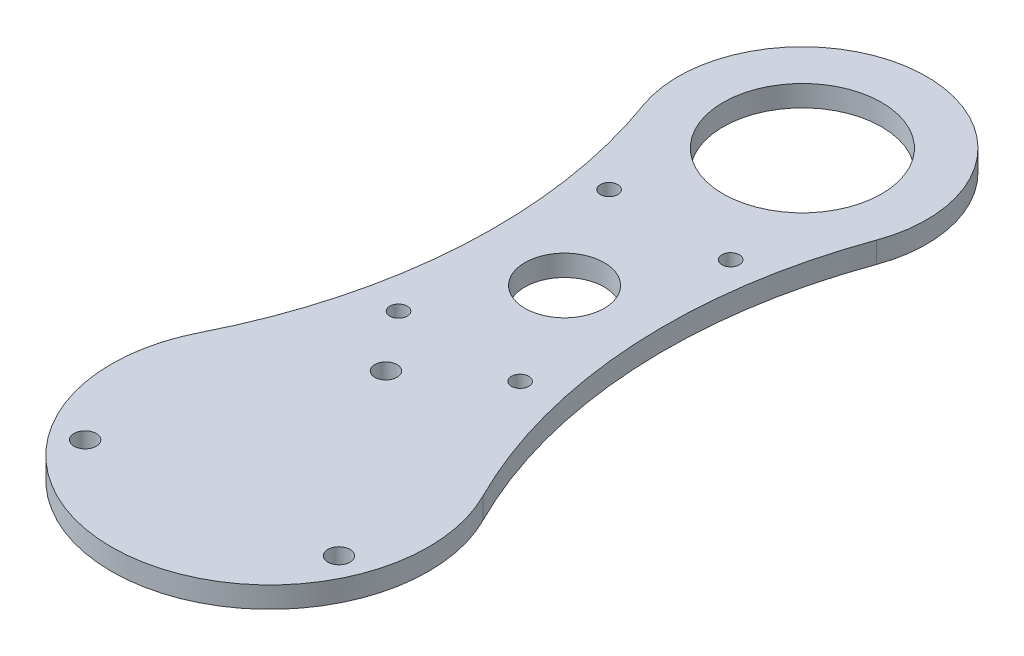
ISO-10303-21;
HEADER;
FILE_DESCRIPTION(('STEP AP214'),'2;1');
FILE_NAME('part.step','',(''),(''),'','','');
FILE_SCHEMA(('AUTOMOTIVE_DESIGN { 1 0 10303 214 1 1 1 1 }'));
ENDSEC;
DATA;
#1=APPLICATION_CONTEXT('core data for automotive mechanical design processes');
#2=APPLICATION_PROTOCOL_DEFINITION('international standard','automotive_design',2000,#1);
#3=PRODUCT_CONTEXT('',#1,'mechanical');
#4=PRODUCT('Part','Part','',(#3));
#5=PRODUCT_RELATED_PRODUCT_CATEGORY('part','',(#4));
#6=PRODUCT_DEFINITION_FORMATION('','',#4);
#7=PRODUCT_DEFINITION_CONTEXT('part definition',#1,'design');
#8=PRODUCT_DEFINITION('design','',#6,#7);
#9=PRODUCT_DEFINITION_SHAPE('','',#8);
#10=(LENGTH_UNIT() NAMED_UNIT(*) SI_UNIT(.MILLI.,.METRE.));
#11=(NAMED_UNIT(*) PLANE_ANGLE_UNIT() SI_UNIT($,.RADIAN.));
#12=(NAMED_UNIT(*) SI_UNIT($,.STERADIAN.) SOLID_ANGLE_UNIT());
#13=UNCERTAINTY_MEASURE_WITH_UNIT(LENGTH_MEASURE(1.E-05),#10,'distance_accuracy_value','');
#14=(GEOMETRIC_REPRESENTATION_CONTEXT(3) GLOBAL_UNCERTAINTY_ASSIGNED_CONTEXT((#13)) GLOBAL_UNIT_ASSIGNED_CONTEXT((#10,
#11,#12)) REPRESENTATION_CONTEXT('',''));
#15=CARTESIAN_POINT('',(0.,0.,0.));
#16=DIRECTION('',(0.,0.,1.));
#17=DIRECTION('',(1.,0.,0.));
#18=AXIS2_PLACEMENT_3D('',#15,#16,#17);
#19=CARTESIAN_POINT('',(-116.069395777869,4.,-58.5482310899345));
#20=DIRECTION('',(0.,-1.,0.));
#21=DIRECTION('',(0.,0.,-1.));
#22=AXIS2_PLACEMENT_3D('',#19,#20,#21);
#23=CYLINDRICAL_SURFACE('',#22,100.);
#24=CARTESIAN_POINT('',(-116.069395777869,0.,-58.5482310899345));
#25=DIRECTION('',(0.,1.,0.));
#26=DIRECTION('',(0.,0.,1.));
#27=AXIS2_PLACEMENT_3D('',#24,#25,#26);
#28=CIRCLE('',#27,100.);
#29=CARTESIAN_POINT('',(-26.7852451795083,0.,-13.5111302515233));
#30=VERTEX_POINT('',#29);
#31=CARTESIAN_POINT('',(-22.0860793585419,0.,-92.7116067256151));
#32=VERTEX_POINT('',#31);
#33=EDGE_CURVE('E101',#30,#32,#28,.T.);
#34=ORIENTED_EDGE('',*,*,#33,.F.);
#35=DIRECTION('',(0.,-1.,0.));
#36=VECTOR('',#35,1.);
#37=CARTESIAN_POINT('',(-26.7852451795083,4.,-13.5111302515233));
#38=LINE('',#37,#36);
#39=CARTESIAN_POINT('',(-26.7852451795083,4.,-13.5111302515233));
#40=VERTEX_POINT('',#39);
#41=EDGE_CURVE('E61',#40,#30,#38,.T.);
#42=ORIENTED_EDGE('',*,*,#41,.F.);
#43=CARTESIAN_POINT('',(-116.069395777869,4.,-58.5482310899345));
#44=DIRECTION('',(0.,1.,0.));
#45=DIRECTION('',(0.,0.,1.));
#46=AXIS2_PLACEMENT_3D('',#43,#44,#45);
#47=CIRCLE('',#46,100.);
#48=CARTESIAN_POINT('',(-22.0860793585419,4.,-92.7116067256151));
#49=VERTEX_POINT('',#48);
#50=EDGE_CURVE('E99',#40,#49,#47,.T.);
#51=ORIENTED_EDGE('',*,*,#50,.T.);
#52=DIRECTION('',(0.,-1.,0.));
#53=VECTOR('',#52,1.);
#54=CARTESIAN_POINT('',(-22.0860793585419,4.,-92.7116067256151));
#55=LINE('',#54,#53);
#56=EDGE_CURVE('E12',#49,#32,#55,.T.);
#57=ORIENTED_EDGE('',*,*,#56,.T.);
#58=EDGE_LOOP('',(#34,#42,#51,#57));
#59=FACE_BOUND('',#58,.T.);
#60=ADVANCED_FACE('F51',(#59),#23,.F.);
#61=CARTESIAN_POINT('',(0.,4.,0.));
#62=DIRECTION('',(0.,-1.,0.));
#63=DIRECTION('',(0.,0.,-1.));
#64=AXIS2_PLACEMENT_3D('',#61,#62,#63);
#65=CYLINDRICAL_SURFACE('',#64,30.);
#66=CARTESIAN_POINT('',(0.,0.,0.));
#67=DIRECTION('',(0.,1.,0.));
#68=DIRECTION('',(0.,0.,1.));
#69=AXIS2_PLACEMENT_3D('',#66,#67,#68);
#70=CIRCLE('',#69,30.);
#71=CARTESIAN_POINT('',(26.7852451795083,0.,-13.5111302515233));
#72=VERTEX_POINT('',#71);
#73=EDGE_CURVE('E116',#30,#72,#70,.T.);
#74=ORIENTED_EDGE('',*,*,#73,.T.);
#75=DIRECTION('',(0.,-1.,0.));
#76=VECTOR('',#75,1.);
#77=CARTESIAN_POINT('',(26.7852451795083,4.,-13.5111302515233));
#78=LINE('',#77,#76);
#79=CARTESIAN_POINT('',(26.7852451795083,4.,-13.5111302515233));
#80=VERTEX_POINT('',#79);
#81=EDGE_CURVE('E84',#80,#72,#78,.T.);
#82=ORIENTED_EDGE('',*,*,#81,.F.);
#83=CARTESIAN_POINT('',(0.,4.,0.));
#84=DIRECTION('',(0.,1.,0.));
#85=DIRECTION('',(0.,0.,1.));
#86=AXIS2_PLACEMENT_3D('',#83,#84,#85);
#87=CIRCLE('',#86,30.);
#88=EDGE_CURVE('E105',#40,#80,#87,.T.);
#89=ORIENTED_EDGE('',*,*,#88,.F.);
#90=ORIENTED_EDGE('',*,*,#41,.T.);
#91=EDGE_LOOP('',(#74,#82,#89,#90));
#92=FACE_BOUND('',#91,.T.);
#93=ADVANCED_FACE('F106',(#92),#65,.T.);
#94=CARTESIAN_POINT('',(116.069395777869,4.,-58.5482310899345));
#95=DIRECTION('',(0.,-1.,0.));
#96=DIRECTION('',(0.,0.,-1.));
#97=AXIS2_PLACEMENT_3D('',#94,#95,#96);
#98=CYLINDRICAL_SURFACE('',#97,100.);
#99=CARTESIAN_POINT('',(116.069395777869,0.,-58.5482310899345));
#100=DIRECTION('',(0.,1.,0.));
#101=DIRECTION('',(0.,0.,1.));
#102=AXIS2_PLACEMENT_3D('',#99,#100,#101);
#103=CIRCLE('',#102,100.);
#104=CARTESIAN_POINT('',(22.0860793585419,0.,-92.7116067256151));
#105=VERTEX_POINT('',#104);
#106=EDGE_CURVE('E113',#105,#72,#103,.T.);
#107=ORIENTED_EDGE('',*,*,#106,.F.);
#108=DIRECTION('',(0.,-1.,0.));
#109=VECTOR('',#108,1.);
#110=CARTESIAN_POINT('',(22.0860793585419,4.,-92.7116067256151));
#111=LINE('',#110,#109);
#112=CARTESIAN_POINT('',(22.0860793585419,4.,-92.7116067256151));
#113=VERTEX_POINT('',#112);
#114=EDGE_CURVE('E70',#113,#105,#111,.T.);
#115=ORIENTED_EDGE('',*,*,#114,.F.);
#116=CARTESIAN_POINT('',(116.069395777869,4.,-58.5482310899345));
#117=DIRECTION('',(0.,1.,0.));
#118=DIRECTION('',(0.,0.,1.));
#119=AXIS2_PLACEMENT_3D('',#116,#117,#118);
#120=CIRCLE('',#119,100.);
#121=EDGE_CURVE('E109',#113,#80,#120,.T.);
#122=ORIENTED_EDGE('',*,*,#121,.T.);
#123=ORIENTED_EDGE('',*,*,#81,.T.);
#124=EDGE_LOOP('',(#107,#115,#122,#123));
#125=FACE_BOUND('',#124,.T.);
#126=ADVANCED_FACE('F187',(#125),#98,.F.);
#127=CARTESIAN_POINT('',(0.,0.,0.));
#128=DIRECTION('',(0.,1.,0.));
#129=DIRECTION('',(0.,0.,1.));
#130=AXIS2_PLACEMENT_3D('',#127,#128,#129);
#131=PLANE('',#130);
#132=CARTESIAN_POINT('',(0.,0.,-100.74));
#133=DIRECTION('',(0.,-1.,0.));
#134=DIRECTION('',(0.,0.,-1.));
#135=AXIS2_PLACEMENT_3D('',#132,#133,#134);
#136=CIRCLE('',#135,15.);
#137=CARTESIAN_POINT('',(0.,0.,-115.74));
#138=VERTEX_POINT('',#137);
#139=EDGE_CURVE('E345',#138,#138,#136,.T.);
#140=ORIENTED_EDGE('',*,*,#139,.F.);
#141=EDGE_LOOP('',(#140));
#142=FACE_BOUND('',#141,.T.);
#143=CARTESIAN_POINT('',(11.5000000000002,0.,-75.6585842870419));
#144=DIRECTION('',(0.,-1.,0.));
#145=DIRECTION('',(-0.866025403784443,0.,0.499999999999992));
#146=AXIS2_PLACEMENT_3D('',#143,#144,#145);
#147=CIRCLE('',#146,1.65);
#148=CARTESIAN_POINT('',(10.0710580837559,0.,-74.833584287042));
#149=VERTEX_POINT('',#148);
#150=EDGE_CURVE('E341',#149,#149,#147,.T.);
#151=ORIENTED_EDGE('',*,*,#150,.F.);
#152=EDGE_LOOP('',(#151));
#153=FACE_BOUND('',#152,.T.);
#154=CARTESIAN_POINT('',(-11.5,0.,-75.6585842870421));
#155=DIRECTION('',(0.,-1.,0.));
#156=DIRECTION('',(0.866025403784436,0.,0.500000000000004));
#157=AXIS2_PLACEMENT_3D('',#154,#155,#156);
#158=CIRCLE('',#157,1.65);
#159=CARTESIAN_POINT('',(-10.0710580837556,0.,-74.8335842870421));
#160=VERTEX_POINT('',#159);
#161=EDGE_CURVE('E146',#160,#160,#158,.T.);
#162=ORIENTED_EDGE('',*,*,#161,.F.);
#163=EDGE_LOOP('',(#162));
#164=FACE_BOUND('',#163,.T.);
#165=CARTESIAN_POINT('',(-11.5,0.,-35.8214157129579));
#166=DIRECTION('',(0.,-1.,0.));
#167=DIRECTION('',(0.,0.,-1.));
#168=AXIS2_PLACEMENT_3D('',#165,#166,#167);
#169=CIRCLE('',#168,1.65);
#170=CARTESIAN_POINT('',(-11.5,0.,-37.4714157129579));
#171=VERTEX_POINT('',#170);
#172=EDGE_CURVE('E140',#171,#171,#169,.T.);
#173=ORIENTED_EDGE('',*,*,#172,.F.);
#174=EDGE_LOOP('',(#173));
#175=FACE_BOUND('',#174,.T.);
#176=CARTESIAN_POINT('',(11.5,0.,-35.8214157129579));
#177=DIRECTION('',(0.,-1.,0.));
#178=DIRECTION('',(0.,0.,-1.));
#179=AXIS2_PLACEMENT_3D('',#176,#177,#178);
#180=CIRCLE('',#179,1.65);
#181=CARTESIAN_POINT('',(11.5,0.,-37.4714157129579));
#182=VERTEX_POINT('',#181);
#183=EDGE_CURVE('E148',#182,#182,#180,.T.);
#184=ORIENTED_EDGE('',*,*,#183,.F.);
#185=EDGE_LOOP('',(#184));
#186=FACE_BOUND('',#185,.T.);
#187=CARTESIAN_POINT('',(0.,0.,-55.74));
#188=DIRECTION('',(0.,-1.,0.));
#189=DIRECTION('',(0.,0.,-1.));
#190=AXIS2_PLACEMENT_3D('',#187,#188,#189);
#191=CIRCLE('',#190,7.5);
#192=CARTESIAN_POINT('',(0.,0.,-63.24));
#193=VERTEX_POINT('',#192);
#194=EDGE_CURVE('E135',#193,#193,#191,.T.);
#195=ORIENTED_EDGE('',*,*,#194,.F.);
#196=EDGE_LOOP('',(#195));
#197=FACE_BOUND('',#196,.T.);
#198=CARTESIAN_POINT('',(-20.0574216302355,0.,14.9231309565708));
#199=DIRECTION('',(0.,1.,0.));
#200=DIRECTION('',(-0.866025403784436,0.,-0.500000000000004));
#201=AXIS2_PLACEMENT_3D('',#198,#199,#200);
#202=CIRCLE('',#201,2.1);
#203=CARTESIAN_POINT('',(-21.8760749781828,0.,13.8731309565708));
#204=VERTEX_POINT('',#203);
#205=EDGE_CURVE('E161',#204,#204,#202,.T.);
#206=ORIENTED_EDGE('',*,*,#205,.T.);
#207=EDGE_LOOP('',(#206));
#208=FACE_BOUND('',#207,.T.);
#209=CARTESIAN_POINT('',(-2.89509969727442,0.,-24.8318021444848));
#210=DIRECTION('',(0.,1.,0.));
#211=DIRECTION('',(0.866025403784443,0.,-0.499999999999992));
#212=AXIS2_PLACEMENT_3D('',#209,#210,#211);
#213=CIRCLE('',#212,2.1);
#214=CARTESIAN_POINT('',(-1.07644634932709,0.,-25.8818021444848));
#215=VERTEX_POINT('',#214);
#216=EDGE_CURVE('E167',#215,#215,#213,.T.);
#217=ORIENTED_EDGE('',*,*,#216,.T.);
#218=EDGE_LOOP('',(#217));
#219=FACE_BOUND('',#218,.T.);
#220=CARTESIAN_POINT('',(22.9525213275101,0.,9.90867118791392));
#221=DIRECTION('',(0.,1.,0.));
#222=DIRECTION('',(0.,0.,1.));
#223=AXIS2_PLACEMENT_3D('',#220,#221,#222);
#224=CIRCLE('',#223,2.1);
#225=CARTESIAN_POINT('',(22.9525213275101,0.,12.0086711879139));
#226=VERTEX_POINT('',#225);
#227=EDGE_CURVE('E130',#226,#226,#224,.T.);
#228=ORIENTED_EDGE('',*,*,#227,.T.);
#229=EDGE_LOOP('',(#228));
#230=FACE_BOUND('',#229,.T.);
#231=ORIENTED_EDGE('',*,*,#33,.T.);
#232=CARTESIAN_POINT('',(0.,0.,-100.74));
#233=DIRECTION('',(0.,1.,0.));
#234=DIRECTION('',(0.,0.,1.));
#235=AXIS2_PLACEMENT_3D('',#232,#233,#234);
#236=CIRCLE('',#235,23.5);
#237=EDGE_CURVE('E128',#105,#32,#236,.T.);
#238=ORIENTED_EDGE('',*,*,#237,.F.);
#239=ORIENTED_EDGE('',*,*,#106,.T.);
#240=ORIENTED_EDGE('',*,*,#73,.F.);
#241=EDGE_LOOP('',(#231,#238,#239,#240));
#242=FACE_BOUND('',#241,.T.);
#243=ADVANCED_FACE('F180',(#142,#153,#164,#175,#186,#197,#208,#219,#230,#242),#131,.F.);
#244=CARTESIAN_POINT('',(0.,4.,0.));
#245=DIRECTION('',(0.,1.,0.));
#246=DIRECTION('',(0.,0.,1.));
#247=AXIS2_PLACEMENT_3D('',#244,#245,#246);
#248=PLANE('',#247);
#249=CARTESIAN_POINT('',(0.,4.,-100.74));
#250=DIRECTION('',(0.,1.,0.));
#251=DIRECTION('',(0.,0.,1.));
#252=AXIS2_PLACEMENT_3D('',#249,#250,#251);
#253=CIRCLE('',#252,15.);
#254=CARTESIAN_POINT('',(0.,4.,-85.74));
#255=VERTEX_POINT('',#254);
#256=EDGE_CURVE('E55',#255,#255,#253,.T.);
#257=ORIENTED_EDGE('',*,*,#256,.F.);
#258=EDGE_LOOP('',(#257));
#259=FACE_BOUND('',#258,.T.);
#260=CARTESIAN_POINT('',(11.5000000000002,4.,-75.6585842870419));
#261=DIRECTION('',(0.,1.,0.));
#262=DIRECTION('',(0.,0.,1.));
#263=AXIS2_PLACEMENT_3D('',#260,#261,#262);
#264=CIRCLE('',#263,1.65);
#265=CARTESIAN_POINT('',(11.5000000000002,4.,-74.0085842870419));
#266=VERTEX_POINT('',#265);
#267=EDGE_CURVE('E145',#266,#266,#264,.T.);
#268=ORIENTED_EDGE('',*,*,#267,.F.);
#269=EDGE_LOOP('',(#268));
#270=FACE_BOUND('',#269,.T.);
#271=CARTESIAN_POINT('',(-11.5,4.,-75.6585842870421));
#272=DIRECTION('',(0.,1.,0.));
#273=DIRECTION('',(0.,0.,1.));
#274=AXIS2_PLACEMENT_3D('',#271,#272,#273);
#275=CIRCLE('',#274,1.65);
#276=CARTESIAN_POINT('',(-11.5,4.,-74.0085842870421));
#277=VERTEX_POINT('',#276);
#278=EDGE_CURVE('E143',#277,#277,#275,.T.);
#279=ORIENTED_EDGE('',*,*,#278,.F.);
#280=EDGE_LOOP('',(#279));
#281=FACE_BOUND('',#280,.T.);
#282=CARTESIAN_POINT('',(-11.5,4.,-35.8214157129579));
#283=DIRECTION('',(0.,1.,0.));
#284=DIRECTION('',(0.,0.,1.));
#285=AXIS2_PLACEMENT_3D('',#282,#283,#284);
#286=CIRCLE('',#285,1.65);
#287=CARTESIAN_POINT('',(-11.5,4.,-34.1714157129579));
#288=VERTEX_POINT('',#287);
#289=EDGE_CURVE('E139',#288,#288,#286,.T.);
#290=ORIENTED_EDGE('',*,*,#289,.F.);
#291=EDGE_LOOP('',(#290));
#292=FACE_BOUND('',#291,.T.);
#293=CARTESIAN_POINT('',(11.5,4.,-35.8214157129579));
#294=DIRECTION('',(0.,1.,0.));
#295=DIRECTION('',(0.,0.,1.));
#296=AXIS2_PLACEMENT_3D('',#293,#294,#295);
#297=CIRCLE('',#296,1.65);
#298=CARTESIAN_POINT('',(11.5,4.,-34.1714157129579));
#299=VERTEX_POINT('',#298);
#300=EDGE_CURVE('E136',#299,#299,#297,.T.);
#301=ORIENTED_EDGE('',*,*,#300,.F.);
#302=EDGE_LOOP('',(#301));
#303=FACE_BOUND('',#302,.T.);
#304=CARTESIAN_POINT('',(0.,4.,-55.74));
#305=DIRECTION('',(0.,1.,0.));
#306=DIRECTION('',(0.,0.,1.));
#307=AXIS2_PLACEMENT_3D('',#304,#305,#306);
#308=CIRCLE('',#307,7.5);
#309=CARTESIAN_POINT('',(0.,4.,-48.24));
#310=VERTEX_POINT('',#309);
#311=EDGE_CURVE('E131',#310,#310,#308,.T.);
#312=ORIENTED_EDGE('',*,*,#311,.F.);
#313=EDGE_LOOP('',(#312));
#314=FACE_BOUND('',#313,.T.);
#315=CARTESIAN_POINT('',(-20.0574216302355,4.,14.9231309565708));
#316=DIRECTION('',(0.,1.,0.));
#317=DIRECTION('',(-0.866025403784436,0.,-0.500000000000004));
#318=AXIS2_PLACEMENT_3D('',#315,#316,#317);
#319=CIRCLE('',#318,2.1);
#320=CARTESIAN_POINT('',(-21.8760749781828,4.,13.8731309565708));
#321=VERTEX_POINT('',#320);
#322=EDGE_CURVE('E164',#321,#321,#319,.T.);
#323=ORIENTED_EDGE('',*,*,#322,.F.);
#324=EDGE_LOOP('',(#323));
#325=FACE_BOUND('',#324,.T.);
#326=CARTESIAN_POINT('',(-2.89509969727442,4.,-24.8318021444848));
#327=DIRECTION('',(0.,1.,0.));
#328=DIRECTION('',(0.866025403784443,0.,-0.499999999999992));
#329=AXIS2_PLACEMENT_3D('',#326,#327,#328);
#330=CIRCLE('',#329,2.1);
#331=CARTESIAN_POINT('',(-1.07644634932709,4.,-25.8818021444848));
#332=VERTEX_POINT('',#331);
#333=EDGE_CURVE('E134',#332,#332,#330,.T.);
#334=ORIENTED_EDGE('',*,*,#333,.F.);
#335=EDGE_LOOP('',(#334));
#336=FACE_BOUND('',#335,.T.);
#337=CARTESIAN_POINT('',(22.9525213275101,4.,9.90867118791392));
#338=DIRECTION('',(0.,1.,0.));
#339=DIRECTION('',(0.,0.,1.));
#340=AXIS2_PLACEMENT_3D('',#337,#338,#339);
#341=CIRCLE('',#340,2.1);
#342=CARTESIAN_POINT('',(22.9525213275101,4.,12.0086711879139));
#343=VERTEX_POINT('',#342);
#344=EDGE_CURVE('E119',#343,#343,#341,.T.);
#345=ORIENTED_EDGE('',*,*,#344,.F.);
#346=EDGE_LOOP('',(#345));
#347=FACE_BOUND('',#346,.T.);
#348=ORIENTED_EDGE('',*,*,#121,.F.);
#349=CARTESIAN_POINT('',(0.,4.,-100.74));
#350=DIRECTION('',(0.,1.,0.));
#351=DIRECTION('',(0.,0.,1.));
#352=AXIS2_PLACEMENT_3D('',#349,#350,#351);
#353=CIRCLE('',#352,23.5);
#354=EDGE_CURVE('E112',#113,#49,#353,.T.);
#355=ORIENTED_EDGE('',*,*,#354,.T.);
#356=ORIENTED_EDGE('',*,*,#50,.F.);
#357=ORIENTED_EDGE('',*,*,#88,.T.);
#358=EDGE_LOOP('',(#348,#355,#356,#357));
#359=FACE_BOUND('',#358,.T.);
#360=ADVANCED_FACE('F111',(#259,#270,#281,#292,#303,#314,#325,#336,#347,#359),#248,.T.);
#361=CARTESIAN_POINT('',(0.,4.,-100.74));
#362=DIRECTION('',(0.,-1.,0.));
#363=DIRECTION('',(0.,0.,-1.));
#364=AXIS2_PLACEMENT_3D('',#361,#362,#363);
#365=CYLINDRICAL_SURFACE('',#364,23.5);
#366=ORIENTED_EDGE('',*,*,#56,.F.);
#367=ORIENTED_EDGE('',*,*,#354,.F.);
#368=ORIENTED_EDGE('',*,*,#114,.T.);
#369=ORIENTED_EDGE('',*,*,#237,.T.);
#370=EDGE_LOOP('',(#366,#367,#368,#369));
#371=FACE_BOUND('',#370,.T.);
#372=ADVANCED_FACE('F53',(#371),#365,.T.);
#373=CARTESIAN_POINT('',(22.9525213275101,0.,9.90867118791392));
#374=DIRECTION('',(0.,1.,0.));
#375=DIRECTION('',(0.,0.,1.));
#376=AXIS2_PLACEMENT_3D('',#373,#374,#375);
#377=CYLINDRICAL_SURFACE('',#376,2.1);
#378=ORIENTED_EDGE('',*,*,#227,.F.);
#379=EDGE_LOOP('',(#378));
#380=FACE_BOUND('',#379,.T.);
#381=ORIENTED_EDGE('',*,*,#344,.T.);
#382=EDGE_LOOP('',(#381));
#383=FACE_BOUND('',#382,.T.);
#384=ADVANCED_FACE('F177',(#380,#383),#377,.F.);
#385=CARTESIAN_POINT('',(-2.89509969727442,0.,-24.8318021444848));
#386=DIRECTION('',(0.,1.,0.));
#387=DIRECTION('',(0.,0.,1.));
#388=AXIS2_PLACEMENT_3D('',#385,#386,#387);
#389=CYLINDRICAL_SURFACE('',#388,2.1);
#390=ORIENTED_EDGE('',*,*,#216,.F.);
#391=EDGE_LOOP('',(#390));
#392=FACE_BOUND('',#391,.T.);
#393=ORIENTED_EDGE('',*,*,#333,.T.);
#394=EDGE_LOOP('',(#393));
#395=FACE_BOUND('',#394,.T.);
#396=ADVANCED_FACE('F276',(#392,#395),#389,.F.);
#397=CARTESIAN_POINT('',(-20.0574216302355,0.,14.9231309565708));
#398=DIRECTION('',(0.,1.,0.));
#399=DIRECTION('',(0.,0.,1.));
#400=AXIS2_PLACEMENT_3D('',#397,#398,#399);
#401=CYLINDRICAL_SURFACE('',#400,2.1);
#402=ORIENTED_EDGE('',*,*,#205,.F.);
#403=EDGE_LOOP('',(#402));
#404=FACE_BOUND('',#403,.T.);
#405=ORIENTED_EDGE('',*,*,#322,.T.);
#406=EDGE_LOOP('',(#405));
#407=FACE_BOUND('',#406,.T.);
#408=ADVANCED_FACE('F268',(#404,#407),#401,.F.);
#409=CARTESIAN_POINT('',(0.,27.5,-55.74));
#410=DIRECTION('',(0.,-1.,0.));
#411=DIRECTION('',(0.,0.,-1.));
#412=AXIS2_PLACEMENT_3D('',#409,#410,#411);
#413=CYLINDRICAL_SURFACE('',#412,7.5);
#414=ORIENTED_EDGE('',*,*,#311,.T.);
#415=EDGE_LOOP('',(#414));
#416=FACE_BOUND('',#415,.T.);
#417=ORIENTED_EDGE('',*,*,#194,.T.);
#418=EDGE_LOOP('',(#417));
#419=FACE_BOUND('',#418,.T.);
#420=ADVANCED_FACE('F260',(#416,#419),#413,.F.);
#421=CARTESIAN_POINT('',(11.5,27.5,-35.8214157129579));
#422=DIRECTION('',(0.,-1.,0.));
#423=DIRECTION('',(0.,0.,-1.));
#424=AXIS2_PLACEMENT_3D('',#421,#422,#423);
#425=CYLINDRICAL_SURFACE('',#424,1.65);
#426=ORIENTED_EDGE('',*,*,#300,.T.);
#427=EDGE_LOOP('',(#426));
#428=FACE_BOUND('',#427,.T.);
#429=ORIENTED_EDGE('',*,*,#183,.T.);
#430=EDGE_LOOP('',(#429));
#431=FACE_BOUND('',#430,.T.);
#432=ADVANCED_FACE('F252',(#428,#431),#425,.F.);
#433=CARTESIAN_POINT('',(-11.5,27.5,-35.8214157129579));
#434=DIRECTION('',(0.,-1.,0.));
#435=DIRECTION('',(0.,0.,-1.));
#436=AXIS2_PLACEMENT_3D('',#433,#434,#435);
#437=CYLINDRICAL_SURFACE('',#436,1.65);
#438=ORIENTED_EDGE('',*,*,#289,.T.);
#439=EDGE_LOOP('',(#438));
#440=FACE_BOUND('',#439,.T.);
#441=ORIENTED_EDGE('',*,*,#172,.T.);
#442=EDGE_LOOP('',(#441));
#443=FACE_BOUND('',#442,.T.);
#444=ADVANCED_FACE('F244',(#440,#443),#437,.F.);
#445=CARTESIAN_POINT('',(-11.5,27.5,-75.6585842870421));
#446=DIRECTION('',(0.,-1.,0.));
#447=DIRECTION('',(0.,0.,-1.));
#448=AXIS2_PLACEMENT_3D('',#445,#446,#447);
#449=CYLINDRICAL_SURFACE('',#448,1.65);
#450=ORIENTED_EDGE('',*,*,#278,.T.);
#451=EDGE_LOOP('',(#450));
#452=FACE_BOUND('',#451,.T.);
#453=ORIENTED_EDGE('',*,*,#161,.T.);
#454=EDGE_LOOP('',(#453));
#455=FACE_BOUND('',#454,.T.);
#456=ADVANCED_FACE('F240',(#452,#455),#449,.F.);
#457=CARTESIAN_POINT('',(11.5000000000002,27.5,-75.6585842870419));
#458=DIRECTION('',(0.,-1.,0.));
#459=DIRECTION('',(0.,0.,-1.));
#460=AXIS2_PLACEMENT_3D('',#457,#458,#459);
#461=CYLINDRICAL_SURFACE('',#460,1.65);
#462=ORIENTED_EDGE('',*,*,#267,.T.);
#463=EDGE_LOOP('',(#462));
#464=FACE_BOUND('',#463,.T.);
#465=ORIENTED_EDGE('',*,*,#150,.T.);
#466=EDGE_LOOP('',(#465));
#467=FACE_BOUND('',#466,.T.);
#468=ADVANCED_FACE('F217',(#464,#467),#461,.F.);
#469=CARTESIAN_POINT('',(0.,29.5,-100.74));
#470=DIRECTION('',(0.,-1.,0.));
#471=DIRECTION('',(0.,0.,-1.));
#472=AXIS2_PLACEMENT_3D('',#469,#470,#471);
#473=CYLINDRICAL_SURFACE('',#472,15.);
#474=ORIENTED_EDGE('',*,*,#256,.T.);
#475=EDGE_LOOP('',(#474));
#476=FACE_BOUND('',#475,.T.);
#477=ORIENTED_EDGE('',*,*,#139,.T.);
#478=EDGE_LOOP('',(#477));
#479=FACE_BOUND('',#478,.T.);
#480=ADVANCED_FACE('F229',(#476,#479),#473,.F.);
#481=CLOSED_SHELL('',(#60,#93,#126,#243,#360,#372,#384,#396,#408,#420,#432,#444,#456,#468,#480));
#482=MANIFOLD_SOLID_BREP('B2',#481);
#483=ADVANCED_BREP_SHAPE_REPRESENTATION('',(#18,#482),#14);
#484=SHAPE_DEFINITION_REPRESENTATION(#9,#483);
ENDSEC;
END-ISO-10303-21;
